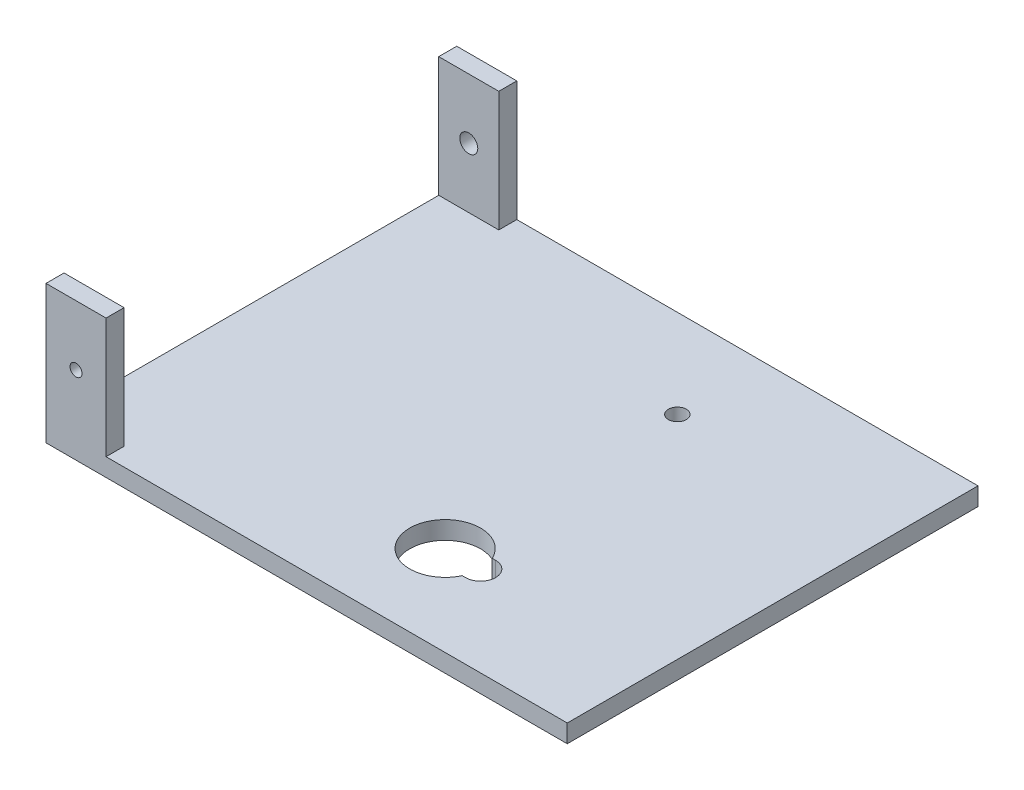
ISO-10303-21;
HEADER;
FILE_DESCRIPTION(('STEP AP214'),'2;1');
FILE_NAME('part.step','',(''),(''),'','','');
FILE_SCHEMA(('AUTOMOTIVE_DESIGN { 1 0 10303 214 1 1 1 1 }'));
ENDSEC;
DATA;
#1=APPLICATION_CONTEXT('core data for automotive mechanical design processes');
#2=APPLICATION_PROTOCOL_DEFINITION('international standard','automotive_design',2000,#1);
#3=PRODUCT_CONTEXT('',#1,'mechanical');
#4=PRODUCT('Part','Part','',(#3));
#5=PRODUCT_RELATED_PRODUCT_CATEGORY('part','',(#4));
#6=PRODUCT_DEFINITION_FORMATION('','',#4);
#7=PRODUCT_DEFINITION_CONTEXT('part definition',#1,'design');
#8=PRODUCT_DEFINITION('design','',#6,#7);
#9=PRODUCT_DEFINITION_SHAPE('','',#8);
#10=(LENGTH_UNIT() NAMED_UNIT(*) SI_UNIT(.MILLI.,.METRE.));
#11=(NAMED_UNIT(*) PLANE_ANGLE_UNIT() SI_UNIT($,.RADIAN.));
#12=(NAMED_UNIT(*) SI_UNIT($,.STERADIAN.) SOLID_ANGLE_UNIT());
#13=UNCERTAINTY_MEASURE_WITH_UNIT(LENGTH_MEASURE(1.E-05),#10,'distance_accuracy_value','');
#14=(GEOMETRIC_REPRESENTATION_CONTEXT(3) GLOBAL_UNCERTAINTY_ASSIGNED_CONTEXT((#13)) GLOBAL_UNIT_ASSIGNED_CONTEXT((#10,
#11,#12)) REPRESENTATION_CONTEXT('',''));
#15=CARTESIAN_POINT('',(0.,0.,0.));
#16=DIRECTION('',(0.,0.,1.));
#17=DIRECTION('',(1.,0.,0.));
#18=AXIS2_PLACEMENT_3D('',#15,#16,#17);
#19=CARTESIAN_POINT('',(0.,3.,0.));
#20=DIRECTION('',(0.,1.,0.));
#21=DIRECTION('',(0.,0.,1.));
#22=AXIS2_PLACEMENT_3D('',#19,#20,#21);
#23=PLANE('',#22);
#24=CARTESIAN_POINT('',(51.4651749457826,3.,53.4));
#25=DIRECTION('',(0.,1.,0.));
#26=DIRECTION('',(0.,0.,1.));
#27=AXIS2_PLACEMENT_3D('',#24,#25,#26);
#28=CIRCLE('',#27,5.9);
#29=CARTESIAN_POINT('',(56.8093306321376,3.,50.9));
#30=VERTEX_POINT('',#29);
#31=CARTESIAN_POINT('',(56.8093306321376,3.,55.9));
#32=VERTEX_POINT('',#31);
#33=EDGE_CURVE('E168',#30,#32,#28,.T.);
#34=ORIENTED_EDGE('',*,*,#33,.F.);
#35=DIRECTION('',(-1.,0.,0.));
#36=VECTOR('',#35,1.);
#37=CARTESIAN_POINT('',(6.30695892337293E-13,3.,50.9000000000007));
#38=LINE('',#37,#36);
#39=CARTESIAN_POINT('',(57.3693306321376,3.,50.9));
#40=VERTEX_POINT('',#39);
#41=EDGE_CURVE('E161',#40,#30,#38,.T.);
#42=ORIENTED_EDGE('',*,*,#41,.F.);
#43=CARTESIAN_POINT('',(57.3693306321376,3.,53.4));
#44=DIRECTION('',(0.,1.,0.));
#45=DIRECTION('',(0.,0.,1.));
#46=AXIS2_PLACEMENT_3D('',#43,#44,#45);
#47=CIRCLE('',#46,2.5);
#48=CARTESIAN_POINT('',(57.3693306321376,3.,55.9));
#49=VERTEX_POINT('',#48);
#50=EDGE_CURVE('E141',#49,#40,#47,.T.);
#51=ORIENTED_EDGE('',*,*,#50,.F.);
#52=DIRECTION('',(1.,0.,0.));
#53=VECTOR('',#52,1.);
#54=CARTESIAN_POINT('',(0.,3.,55.9));
#55=LINE('',#54,#53);
#56=EDGE_CURVE('E166',#32,#49,#55,.T.);
#57=ORIENTED_EDGE('',*,*,#56,.F.);
#58=EDGE_LOOP('',(#34,#42,#51,#57));
#59=FACE_BOUND('',#58,.T.);
#60=CARTESIAN_POINT('',(51.4651749457826,3.,14.7308319093042));
#61=DIRECTION('',(0.,1.,0.));
#62=DIRECTION('',(0.,0.,1.));
#63=AXIS2_PLACEMENT_3D('',#60,#61,#62);
#64=CIRCLE('',#63,1.5);
#65=CARTESIAN_POINT('',(51.4651749457826,3.,16.2308319093042));
#66=VERTEX_POINT('',#65);
#67=EDGE_CURVE('E173',#66,#66,#64,.T.);
#68=ORIENTED_EDGE('',*,*,#67,.F.);
#69=EDGE_LOOP('',(#68));
#70=FACE_BOUND('',#69,.T.);
#71=DIRECTION('',(0.,0.,-1.));
#72=VECTOR('',#71,1.);
#73=CARTESIAN_POINT('',(10.,3.,0.));
#74=LINE('',#73,#72);
#75=CARTESIAN_POINT('',(10.,3.,3.));
#76=VERTEX_POINT('',#75);
#77=CARTESIAN_POINT('',(10.,3.,0.));
#78=VERTEX_POINT('',#77);
#79=EDGE_CURVE('E189',#76,#78,#74,.T.);
#80=ORIENTED_EDGE('',*,*,#79,.F.);
#81=DIRECTION('',(1.,0.,0.));
#82=VECTOR('',#81,1.);
#83=CARTESIAN_POINT('',(0.,3.,3.));
#84=LINE('',#83,#82);
#85=CARTESIAN_POINT('',(0.,3.,3.));
#86=VERTEX_POINT('',#85);
#87=EDGE_CURVE('E197',#86,#76,#84,.T.);
#88=ORIENTED_EDGE('',*,*,#87,.F.);
#89=DIRECTION('',(0.,0.,1.));
#90=VECTOR('',#89,1.);
#91=CARTESIAN_POINT('',(0.,3.,0.));
#92=LINE('',#91,#90);
#93=CARTESIAN_POINT('',(0.,3.,65.4));
#94=VERTEX_POINT('',#93);
#95=EDGE_CURVE('E235',#86,#94,#92,.T.);
#96=ORIENTED_EDGE('',*,*,#95,.T.);
#97=DIRECTION('',(-1.,0.,0.));
#98=VECTOR('',#97,1.);
#99=CARTESIAN_POINT('',(0.,3.,65.4));
#100=LINE('',#99,#98);
#101=CARTESIAN_POINT('',(10.,3.,65.4));
#102=VERTEX_POINT('',#101);
#103=EDGE_CURVE('E215',#102,#94,#100,.T.);
#104=ORIENTED_EDGE('',*,*,#103,.F.);
#105=DIRECTION('',(0.,0.,-1.));
#106=VECTOR('',#105,1.);
#107=CARTESIAN_POINT('',(10.,3.,68.4));
#108=LINE('',#107,#106);
#109=CARTESIAN_POINT('',(10.,3.,68.4));
#110=VERTEX_POINT('',#109);
#111=EDGE_CURVE('E210',#110,#102,#108,.T.);
#112=ORIENTED_EDGE('',*,*,#111,.F.);
#113=DIRECTION('',(1.,0.,0.));
#114=VECTOR('',#113,1.);
#115=CARTESIAN_POINT('',(0.,3.,68.4));
#116=LINE('',#115,#114);
#117=CARTESIAN_POINT('',(86.8,3.,68.4));
#118=VERTEX_POINT('',#117);
#119=EDGE_CURVE('E237',#110,#118,#116,.T.);
#120=ORIENTED_EDGE('',*,*,#119,.T.);
#121=DIRECTION('',(0.,0.,-1.));
#122=VECTOR('',#121,1.);
#123=CARTESIAN_POINT('',(86.8,3.,0.));
#124=LINE('',#123,#122);
#125=CARTESIAN_POINT('',(86.8,3.,0.));
#126=VERTEX_POINT('',#125);
#127=EDGE_CURVE('E240',#118,#126,#124,.T.);
#128=ORIENTED_EDGE('',*,*,#127,.T.);
#129=DIRECTION('',(-1.,0.,0.));
#130=VECTOR('',#129,1.);
#131=CARTESIAN_POINT('',(0.,3.,0.));
#132=LINE('',#131,#130);
#133=EDGE_CURVE('E242',#126,#78,#132,.T.);
#134=ORIENTED_EDGE('',*,*,#133,.T.);
#135=EDGE_LOOP('',(#80,#88,#96,#104,#112,#120,#128,#134));
#136=FACE_BOUND('',#135,.T.);
#137=ADVANCED_FACE('F33',(#59,#70,#136),#23,.T.);
#138=CARTESIAN_POINT('',(0.,3.,0.));
#139=DIRECTION('',(1.,0.,0.));
#140=DIRECTION('',(0.,0.,-1.));
#141=AXIS2_PLACEMENT_3D('',#138,#139,#140);
#142=PLANE('',#141);
#143=DIRECTION('',(0.,0.,1.));
#144=VECTOR('',#143,1.);
#145=CARTESIAN_POINT('',(0.,0.,0.));
#146=LINE('',#145,#144);
#147=CARTESIAN_POINT('',(0.,0.,0.));
#148=VERTEX_POINT('',#147);
#149=CARTESIAN_POINT('',(0.,0.,68.4));
#150=VERTEX_POINT('',#149);
#151=EDGE_CURVE('E234',#148,#150,#146,.T.);
#152=ORIENTED_EDGE('',*,*,#151,.T.);
#153=DIRECTION('',(0.,-1.,0.));
#154=VECTOR('',#153,1.);
#155=CARTESIAN_POINT('',(0.,3.,68.4));
#156=LINE('',#155,#154);
#157=CARTESIAN_POINT('',(0.,23.,68.4));
#158=VERTEX_POINT('',#157);
#159=EDGE_CURVE('E11',#158,#150,#156,.T.);
#160=ORIENTED_EDGE('',*,*,#159,.F.);
#161=DIRECTION('',(0.,0.,1.));
#162=VECTOR('',#161,1.);
#163=CARTESIAN_POINT('',(0.,23.,68.4));
#164=LINE('',#163,#162);
#165=CARTESIAN_POINT('',(0.,23.,65.4));
#166=VERTEX_POINT('',#165);
#167=EDGE_CURVE('E211',#166,#158,#164,.T.);
#168=ORIENTED_EDGE('',*,*,#167,.F.);
#169=DIRECTION('',(0.,-1.,0.));
#170=VECTOR('',#169,1.);
#171=CARTESIAN_POINT('',(0.,23.,65.4));
#172=LINE('',#171,#170);
#173=EDGE_CURVE('E221',#166,#94,#172,.T.);
#174=ORIENTED_EDGE('',*,*,#173,.T.);
#175=ORIENTED_EDGE('',*,*,#95,.F.);
#176=DIRECTION('',(0.,-1.,0.));
#177=VECTOR('',#176,1.);
#178=CARTESIAN_POINT('',(0.,23.,3.));
#179=LINE('',#178,#177);
#180=CARTESIAN_POINT('',(0.,23.,3.));
#181=VERTEX_POINT('',#180);
#182=EDGE_CURVE('E207',#181,#86,#179,.T.);
#183=ORIENTED_EDGE('',*,*,#182,.F.);
#184=DIRECTION('',(0.,0.,1.));
#185=VECTOR('',#184,1.);
#186=CARTESIAN_POINT('',(0.,23.,0.));
#187=LINE('',#186,#185);
#188=CARTESIAN_POINT('',(0.,23.,0.));
#189=VERTEX_POINT('',#188);
#190=EDGE_CURVE('E185',#189,#181,#187,.T.);
#191=ORIENTED_EDGE('',*,*,#190,.F.);
#192=DIRECTION('',(0.,-1.,0.));
#193=VECTOR('',#192,1.);
#194=CARTESIAN_POINT('',(0.,3.,0.));
#195=LINE('',#194,#193);
#196=EDGE_CURVE('E244',#189,#148,#195,.T.);
#197=ORIENTED_EDGE('',*,*,#196,.T.);
#198=EDGE_LOOP('',(#152,#160,#168,#174,#175,#183,#191,#197));
#199=FACE_BOUND('',#198,.T.);
#200=ADVANCED_FACE('F35',(#199),#142,.F.);
#201=CARTESIAN_POINT('',(0.,3.,68.4));
#202=DIRECTION('',(0.,0.,-1.));
#203=DIRECTION('',(-1.,0.,0.));
#204=AXIS2_PLACEMENT_3D('',#201,#202,#203);
#205=PLANE('',#204);
#206=CARTESIAN_POINT('',(5.,13.,68.4));
#207=DIRECTION('',(0.,0.,1.));
#208=DIRECTION('',(1.,0.,0.));
#209=AXIS2_PLACEMENT_3D('',#206,#207,#208);
#210=CIRCLE('',#209,1.);
#211=CARTESIAN_POINT('',(6.,13.,68.4));
#212=VERTEX_POINT('',#211);
#213=EDGE_CURVE('E182',#212,#212,#210,.T.);
#214=ORIENTED_EDGE('',*,*,#213,.F.);
#215=EDGE_LOOP('',(#214));
#216=FACE_BOUND('',#215,.T.);
#217=DIRECTION('',(1.,0.,0.));
#218=VECTOR('',#217,1.);
#219=CARTESIAN_POINT('',(0.,0.,68.4));
#220=LINE('',#219,#218);
#221=CARTESIAN_POINT('',(86.8,0.,68.4));
#222=VERTEX_POINT('',#221);
#223=EDGE_CURVE('E247',#150,#222,#220,.T.);
#224=ORIENTED_EDGE('',*,*,#223,.T.);
#225=DIRECTION('',(0.,-1.,0.));
#226=VECTOR('',#225,1.);
#227=CARTESIAN_POINT('',(86.8,3.,68.4));
#228=LINE('',#227,#226);
#229=EDGE_CURVE('E42',#118,#222,#228,.T.);
#230=ORIENTED_EDGE('',*,*,#229,.F.);
#231=ORIENTED_EDGE('',*,*,#119,.F.);
#232=DIRECTION('',(0.,-1.,0.));
#233=VECTOR('',#232,1.);
#234=CARTESIAN_POINT('',(10.,23.,68.4));
#235=LINE('',#234,#233);
#236=CARTESIAN_POINT('',(10.,23.,68.4));
#237=VERTEX_POINT('',#236);
#238=EDGE_CURVE('E231',#237,#110,#235,.T.);
#239=ORIENTED_EDGE('',*,*,#238,.F.);
#240=DIRECTION('',(1.,0.,0.));
#241=VECTOR('',#240,1.);
#242=CARTESIAN_POINT('',(0.,23.,68.4));
#243=LINE('',#242,#241);
#244=EDGE_CURVE('E214',#158,#237,#243,.T.);
#245=ORIENTED_EDGE('',*,*,#244,.F.);
#246=ORIENTED_EDGE('',*,*,#159,.T.);
#247=EDGE_LOOP('',(#224,#230,#231,#239,#245,#246));
#248=FACE_BOUND('',#247,.T.);
#249=ADVANCED_FACE('F308',(#216,#248),#205,.F.);
#250=CARTESIAN_POINT('',(86.8,3.,0.));
#251=DIRECTION('',(-1.,0.,0.));
#252=DIRECTION('',(0.,0.,1.));
#253=AXIS2_PLACEMENT_3D('',#250,#251,#252);
#254=PLANE('',#253);
#255=DIRECTION('',(0.,0.,-1.));
#256=VECTOR('',#255,1.);
#257=CARTESIAN_POINT('',(86.8,0.,0.));
#258=LINE('',#257,#256);
#259=CARTESIAN_POINT('',(86.8,0.,0.));
#260=VERTEX_POINT('',#259);
#261=EDGE_CURVE('E249',#222,#260,#258,.T.);
#262=ORIENTED_EDGE('',*,*,#261,.T.);
#263=DIRECTION('',(0.,-1.,0.));
#264=VECTOR('',#263,1.);
#265=CARTESIAN_POINT('',(86.8,3.,0.));
#266=LINE('',#265,#264);
#267=EDGE_CURVE('E254',#126,#260,#266,.T.);
#268=ORIENTED_EDGE('',*,*,#267,.F.);
#269=ORIENTED_EDGE('',*,*,#127,.F.);
#270=ORIENTED_EDGE('',*,*,#229,.T.);
#271=EDGE_LOOP('',(#262,#268,#269,#270));
#272=FACE_BOUND('',#271,.T.);
#273=ADVANCED_FACE('F262',(#272),#254,.F.);
#274=CARTESIAN_POINT('',(0.,3.,0.));
#275=DIRECTION('',(0.,0.,1.));
#276=DIRECTION('',(1.,0.,0.));
#277=AXIS2_PLACEMENT_3D('',#274,#275,#276);
#278=PLANE('',#277);
#279=CARTESIAN_POINT('',(5.,13.,0.));
#280=DIRECTION('',(0.,0.,1.));
#281=DIRECTION('',(1.,0.,0.));
#282=AXIS2_PLACEMENT_3D('',#279,#280,#281);
#283=CIRCLE('',#282,1.5);
#284=CARTESIAN_POINT('',(6.5,13.,0.));
#285=VERTEX_POINT('',#284);
#286=EDGE_CURVE('E179',#285,#285,#283,.T.);
#287=ORIENTED_EDGE('',*,*,#286,.T.);
#288=EDGE_LOOP('',(#287));
#289=FACE_BOUND('',#288,.T.);
#290=DIRECTION('',(-1.,0.,0.));
#291=VECTOR('',#290,1.);
#292=CARTESIAN_POINT('',(0.,0.,0.));
#293=LINE('',#292,#291);
#294=EDGE_CURVE('E238',#260,#148,#293,.T.);
#295=ORIENTED_EDGE('',*,*,#294,.T.);
#296=ORIENTED_EDGE('',*,*,#196,.F.);
#297=DIRECTION('',(-1.,0.,0.));
#298=VECTOR('',#297,1.);
#299=CARTESIAN_POINT('',(0.,23.,0.));
#300=LINE('',#299,#298);
#301=CARTESIAN_POINT('',(10.,23.,0.));
#302=VERTEX_POINT('',#301);
#303=EDGE_CURVE('E193',#302,#189,#300,.T.);
#304=ORIENTED_EDGE('',*,*,#303,.F.);
#305=DIRECTION('',(0.,-1.,0.));
#306=VECTOR('',#305,1.);
#307=CARTESIAN_POINT('',(10.,23.,0.));
#308=LINE('',#307,#306);
#309=EDGE_CURVE('E196',#302,#78,#308,.T.);
#310=ORIENTED_EDGE('',*,*,#309,.T.);
#311=ORIENTED_EDGE('',*,*,#133,.F.);
#312=ORIENTED_EDGE('',*,*,#267,.T.);
#313=EDGE_LOOP('',(#295,#296,#304,#310,#311,#312));
#314=FACE_BOUND('',#313,.T.);
#315=ADVANCED_FACE('F270',(#289,#314),#278,.F.);
#316=CARTESIAN_POINT('',(0.,0.,0.));
#317=DIRECTION('',(0.,1.,0.));
#318=DIRECTION('',(0.,0.,1.));
#319=AXIS2_PLACEMENT_3D('',#316,#317,#318);
#320=PLANE('',#319);
#321=DIRECTION('',(1.,0.,0.));
#322=VECTOR('',#321,1.);
#323=CARTESIAN_POINT('',(57.3693306321376,0.,50.9));
#324=LINE('',#323,#322);
#325=CARTESIAN_POINT('',(56.8093306321376,0.,50.9));
#326=VERTEX_POINT('',#325);
#327=CARTESIAN_POINT('',(57.3693306321376,0.,50.9));
#328=VERTEX_POINT('',#327);
#329=EDGE_CURVE('E147',#326,#328,#324,.T.);
#330=ORIENTED_EDGE('',*,*,#329,.F.);
#331=CARTESIAN_POINT('',(51.4651749457826,0.,53.4));
#332=DIRECTION('',(0.,-1.,0.));
#333=DIRECTION('',(0.,0.,-1.));
#334=AXIS2_PLACEMENT_3D('',#331,#332,#333);
#335=CIRCLE('',#334,5.9);
#336=CARTESIAN_POINT('',(56.8093306321376,0.,55.9));
#337=VERTEX_POINT('',#336);
#338=EDGE_CURVE('E57',#337,#326,#335,.T.);
#339=ORIENTED_EDGE('',*,*,#338,.F.);
#340=DIRECTION('',(-1.,0.,0.));
#341=VECTOR('',#340,1.);
#342=CARTESIAN_POINT('',(56.8093306321376,0.,55.9));
#343=LINE('',#342,#341);
#344=CARTESIAN_POINT('',(57.3693306321376,0.,55.9));
#345=VERTEX_POINT('',#344);
#346=EDGE_CURVE('E154',#345,#337,#343,.T.);
#347=ORIENTED_EDGE('',*,*,#346,.F.);
#348=CARTESIAN_POINT('',(57.3693306321376,0.,53.4));
#349=DIRECTION('',(0.,-1.,0.));
#350=DIRECTION('',(0.,0.,1.));
#351=AXIS2_PLACEMENT_3D('',#348,#349,#350);
#352=CIRCLE('',#351,2.5);
#353=EDGE_CURVE('E138',#328,#345,#352,.T.);
#354=ORIENTED_EDGE('',*,*,#353,.F.);
#355=EDGE_LOOP('',(#330,#339,#347,#354));
#356=FACE_BOUND('',#355,.T.);
#357=CARTESIAN_POINT('',(51.4651749457826,0.,14.7308319093042));
#358=DIRECTION('',(0.,-1.,0.));
#359=DIRECTION('',(0.,0.,-1.));
#360=AXIS2_PLACEMENT_3D('',#357,#358,#359);
#361=CIRCLE('',#360,1.5);
#362=CARTESIAN_POINT('',(51.4651749457826,0.,13.2308319093042));
#363=VERTEX_POINT('',#362);
#364=EDGE_CURVE('E170',#363,#363,#361,.T.);
#365=ORIENTED_EDGE('',*,*,#364,.F.);
#366=EDGE_LOOP('',(#365));
#367=FACE_BOUND('',#366,.T.);
#368=ORIENTED_EDGE('',*,*,#151,.F.);
#369=ORIENTED_EDGE('',*,*,#294,.F.);
#370=ORIENTED_EDGE('',*,*,#261,.F.);
#371=ORIENTED_EDGE('',*,*,#223,.F.);
#372=EDGE_LOOP('',(#368,#369,#370,#371));
#373=FACE_BOUND('',#372,.T.);
#374=ADVANCED_FACE('F151',(#356,#367,#373),#320,.F.);
#375=CARTESIAN_POINT('',(10.,23.,68.4));
#376=DIRECTION('',(-1.,0.,0.));
#377=DIRECTION('',(0.,0.,1.));
#378=AXIS2_PLACEMENT_3D('',#375,#376,#377);
#379=PLANE('',#378);
#380=ORIENTED_EDGE('',*,*,#111,.T.);
#381=DIRECTION('',(0.,-1.,0.));
#382=VECTOR('',#381,1.);
#383=CARTESIAN_POINT('',(10.,23.,65.4));
#384=LINE('',#383,#382);
#385=CARTESIAN_POINT('',(10.,23.,65.4));
#386=VERTEX_POINT('',#385);
#387=EDGE_CURVE('E228',#386,#102,#384,.T.);
#388=ORIENTED_EDGE('',*,*,#387,.F.);
#389=DIRECTION('',(0.,0.,-1.));
#390=VECTOR('',#389,1.);
#391=CARTESIAN_POINT('',(10.,23.,68.4));
#392=LINE('',#391,#390);
#393=EDGE_CURVE('E217',#237,#386,#392,.T.);
#394=ORIENTED_EDGE('',*,*,#393,.F.);
#395=ORIENTED_EDGE('',*,*,#238,.T.);
#396=EDGE_LOOP('',(#380,#388,#394,#395));
#397=FACE_BOUND('',#396,.T.);
#398=ADVANCED_FACE('F313',(#397),#379,.F.);
#399=CARTESIAN_POINT('',(0.,23.,65.4));
#400=DIRECTION('',(0.,0.,1.));
#401=DIRECTION('',(1.,0.,0.));
#402=AXIS2_PLACEMENT_3D('',#399,#400,#401);
#403=PLANE('',#402);
#404=CARTESIAN_POINT('',(5.,13.,65.4));
#405=DIRECTION('',(0.,0.,1.));
#406=DIRECTION('',(1.,0.,0.));
#407=AXIS2_PLACEMENT_3D('',#404,#405,#406);
#408=CIRCLE('',#407,1.);
#409=CARTESIAN_POINT('',(6.,13.,65.4));
#410=VERTEX_POINT('',#409);
#411=EDGE_CURVE('E37',#410,#410,#408,.T.);
#412=ORIENTED_EDGE('',*,*,#411,.T.);
#413=EDGE_LOOP('',(#412));
#414=FACE_BOUND('',#413,.T.);
#415=ORIENTED_EDGE('',*,*,#103,.T.);
#416=ORIENTED_EDGE('',*,*,#173,.F.);
#417=DIRECTION('',(-1.,0.,0.));
#418=VECTOR('',#417,1.);
#419=CARTESIAN_POINT('',(0.,23.,65.4));
#420=LINE('',#419,#418);
#421=EDGE_CURVE('E219',#386,#166,#420,.T.);
#422=ORIENTED_EDGE('',*,*,#421,.F.);
#423=ORIENTED_EDGE('',*,*,#387,.T.);
#424=EDGE_LOOP('',(#415,#416,#422,#423));
#425=FACE_BOUND('',#424,.T.);
#426=ADVANCED_FACE('F296',(#414,#425),#403,.F.);
#427=CARTESIAN_POINT('',(0.,23.,0.));
#428=DIRECTION('',(0.,-1.,0.));
#429=DIRECTION('',(0.,0.,-1.));
#430=AXIS2_PLACEMENT_3D('',#427,#428,#429);
#431=PLANE('',#430);
#432=ORIENTED_EDGE('',*,*,#167,.T.);
#433=ORIENTED_EDGE('',*,*,#244,.T.);
#434=ORIENTED_EDGE('',*,*,#393,.T.);
#435=ORIENTED_EDGE('',*,*,#421,.T.);
#436=EDGE_LOOP('',(#432,#433,#434,#435));
#437=FACE_BOUND('',#436,.T.);
#438=ADVANCED_FACE('F288',(#437),#431,.F.);
#439=CARTESIAN_POINT('',(0.,23.,3.));
#440=DIRECTION('',(0.,0.,-1.));
#441=DIRECTION('',(-1.,0.,0.));
#442=AXIS2_PLACEMENT_3D('',#439,#440,#441);
#443=PLANE('',#442);
#444=CARTESIAN_POINT('',(5.,13.,3.));
#445=DIRECTION('',(0.,0.,1.));
#446=DIRECTION('',(1.,0.,0.));
#447=AXIS2_PLACEMENT_3D('',#444,#445,#446);
#448=CIRCLE('',#447,1.5);
#449=CARTESIAN_POINT('',(6.5,13.,3.));
#450=VERTEX_POINT('',#449);
#451=EDGE_CURVE('E176',#450,#450,#448,.T.);
#452=ORIENTED_EDGE('',*,*,#451,.F.);
#453=EDGE_LOOP('',(#452));
#454=FACE_BOUND('',#453,.T.);
#455=ORIENTED_EDGE('',*,*,#87,.T.);
#456=DIRECTION('',(0.,-1.,0.));
#457=VECTOR('',#456,1.);
#458=CARTESIAN_POINT('',(10.,23.,3.));
#459=LINE('',#458,#457);
#460=CARTESIAN_POINT('',(10.,23.,3.));
#461=VERTEX_POINT('',#460);
#462=EDGE_CURVE('E204',#461,#76,#459,.T.);
#463=ORIENTED_EDGE('',*,*,#462,.F.);
#464=DIRECTION('',(1.,0.,0.));
#465=VECTOR('',#464,1.);
#466=CARTESIAN_POINT('',(0.,23.,3.));
#467=LINE('',#466,#465);
#468=EDGE_CURVE('E188',#181,#461,#467,.T.);
#469=ORIENTED_EDGE('',*,*,#468,.F.);
#470=ORIENTED_EDGE('',*,*,#182,.T.);
#471=EDGE_LOOP('',(#455,#463,#469,#470));
#472=FACE_BOUND('',#471,.T.);
#473=ADVANCED_FACE('F286',(#454,#472),#443,.F.);
#474=CARTESIAN_POINT('',(10.,23.,0.));
#475=DIRECTION('',(-1.,0.,0.));
#476=DIRECTION('',(0.,0.,1.));
#477=AXIS2_PLACEMENT_3D('',#474,#475,#476);
#478=PLANE('',#477);
#479=ORIENTED_EDGE('',*,*,#79,.T.);
#480=ORIENTED_EDGE('',*,*,#309,.F.);
#481=DIRECTION('',(0.,0.,-1.));
#482=VECTOR('',#481,1.);
#483=CARTESIAN_POINT('',(10.,23.,0.));
#484=LINE('',#483,#482);
#485=EDGE_CURVE('E191',#461,#302,#484,.T.);
#486=ORIENTED_EDGE('',*,*,#485,.F.);
#487=ORIENTED_EDGE('',*,*,#462,.T.);
#488=EDGE_LOOP('',(#479,#480,#486,#487));
#489=FACE_BOUND('',#488,.T.);
#490=ADVANCED_FACE('F283',(#489),#478,.F.);
#491=CARTESIAN_POINT('',(0.,23.,0.));
#492=DIRECTION('',(0.,1.,0.));
#493=DIRECTION('',(0.,0.,1.));
#494=AXIS2_PLACEMENT_3D('',#491,#492,#493);
#495=PLANE('',#494);
#496=ORIENTED_EDGE('',*,*,#190,.T.);
#497=ORIENTED_EDGE('',*,*,#468,.T.);
#498=ORIENTED_EDGE('',*,*,#485,.T.);
#499=ORIENTED_EDGE('',*,*,#303,.T.);
#500=EDGE_LOOP('',(#496,#497,#498,#499));
#501=FACE_BOUND('',#500,.T.);
#502=ADVANCED_FACE('F278',(#501),#495,.T.);
#503=CARTESIAN_POINT('',(5.,13.,48.4));
#504=DIRECTION('',(0.,0.,1.));
#505=DIRECTION('',(1.,0.,0.));
#506=AXIS2_PLACEMENT_3D('',#503,#504,#505);
#507=CYLINDRICAL_SURFACE('',#506,1.);
#508=ORIENTED_EDGE('',*,*,#213,.T.);
#509=EDGE_LOOP('',(#508));
#510=FACE_BOUND('',#509,.T.);
#511=ORIENTED_EDGE('',*,*,#411,.F.);
#512=EDGE_LOOP('',(#511));
#513=FACE_BOUND('',#512,.T.);
#514=ADVANCED_FACE('F345',(#510,#513),#507,.F.);
#515=CARTESIAN_POINT('',(5.,13.,-17.));
#516=DIRECTION('',(0.,0.,1.));
#517=DIRECTION('',(1.,0.,0.));
#518=AXIS2_PLACEMENT_3D('',#515,#516,#517);
#519=CYLINDRICAL_SURFACE('',#518,1.5);
#520=ORIENTED_EDGE('',*,*,#451,.T.);
#521=EDGE_LOOP('',(#520));
#522=FACE_BOUND('',#521,.T.);
#523=ORIENTED_EDGE('',*,*,#286,.F.);
#524=EDGE_LOOP('',(#523));
#525=FACE_BOUND('',#524,.T.);
#526=ADVANCED_FACE('F347',(#522,#525),#519,.F.);
#527=CARTESIAN_POINT('',(51.4651749457826,20.,14.7308319093042));
#528=DIRECTION('',(0.,-1.,0.));
#529=DIRECTION('',(0.,0.,-1.));
#530=AXIS2_PLACEMENT_3D('',#527,#528,#529);
#531=CYLINDRICAL_SURFACE('',#530,1.5);
#532=ORIENTED_EDGE('',*,*,#67,.T.);
#533=EDGE_LOOP('',(#532));
#534=FACE_BOUND('',#533,.T.);
#535=ORIENTED_EDGE('',*,*,#364,.T.);
#536=EDGE_LOOP('',(#535));
#537=FACE_BOUND('',#536,.T.);
#538=ADVANCED_FACE('F354',(#534,#537),#531,.F.);
#539=CARTESIAN_POINT('',(51.4651749457826,10.,53.4));
#540=DIRECTION('',(0.,-1.,0.));
#541=DIRECTION('',(0.,0.,-1.));
#542=AXIS2_PLACEMENT_3D('',#539,#540,#541);
#543=CYLINDRICAL_SURFACE('',#542,5.9);
#544=ORIENTED_EDGE('',*,*,#33,.T.);
#545=DIRECTION('',(0.,-1.,0.));
#546=VECTOR('',#545,1.);
#547=CARTESIAN_POINT('',(56.8093306321376,10.,55.9));
#548=LINE('',#547,#546);
#549=EDGE_CURVE('E159',#32,#337,#548,.T.);
#550=ORIENTED_EDGE('',*,*,#549,.T.);
#551=ORIENTED_EDGE('',*,*,#338,.T.);
#552=DIRECTION('',(0.,-1.,0.));
#553=VECTOR('',#552,1.);
#554=CARTESIAN_POINT('',(56.8093306321376,10.,50.9));
#555=LINE('',#554,#553);
#556=EDGE_CURVE('E144',#30,#326,#555,.T.);
#557=ORIENTED_EDGE('',*,*,#556,.F.);
#558=EDGE_LOOP('',(#544,#550,#551,#557));
#559=FACE_BOUND('',#558,.T.);
#560=ADVANCED_FACE('F361',(#559),#543,.F.);
#561=CARTESIAN_POINT('',(56.8093306321376,10.,55.9));
#562=DIRECTION('',(0.,0.,1.));
#563=DIRECTION('',(1.,0.,0.));
#564=AXIS2_PLACEMENT_3D('',#561,#562,#563);
#565=PLANE('',#564);
#566=ORIENTED_EDGE('',*,*,#56,.T.);
#567=DIRECTION('',(0.,-1.,0.));
#568=VECTOR('',#567,1.);
#569=CARTESIAN_POINT('',(57.3693306321376,10.,55.9));
#570=LINE('',#569,#568);
#571=EDGE_CURVE('E143',#49,#345,#570,.T.);
#572=ORIENTED_EDGE('',*,*,#571,.T.);
#573=ORIENTED_EDGE('',*,*,#346,.T.);
#574=ORIENTED_EDGE('',*,*,#549,.F.);
#575=EDGE_LOOP('',(#566,#572,#573,#574));
#576=FACE_BOUND('',#575,.T.);
#577=ADVANCED_FACE('F365',(#576),#565,.F.);
#578=CARTESIAN_POINT('',(57.3693306321376,10.,53.4));
#579=DIRECTION('',(0.,-1.,0.));
#580=DIRECTION('',(0.,0.,-1.));
#581=AXIS2_PLACEMENT_3D('',#578,#579,#580);
#582=CYLINDRICAL_SURFACE('',#581,2.5);
#583=ORIENTED_EDGE('',*,*,#50,.T.);
#584=DIRECTION('',(0.,-1.,0.));
#585=VECTOR('',#584,1.);
#586=CARTESIAN_POINT('',(57.3693306321376,10.,50.9));
#587=LINE('',#586,#585);
#588=EDGE_CURVE('E49',#40,#328,#587,.T.);
#589=ORIENTED_EDGE('',*,*,#588,.T.);
#590=ORIENTED_EDGE('',*,*,#353,.T.);
#591=ORIENTED_EDGE('',*,*,#571,.F.);
#592=EDGE_LOOP('',(#583,#589,#590,#591));
#593=FACE_BOUND('',#592,.T.);
#594=ADVANCED_FACE('F135',(#593),#582,.F.);
#595=CARTESIAN_POINT('',(57.3693306321376,10.,50.9));
#596=DIRECTION('',(0.,0.,-1.));
#597=DIRECTION('',(-1.,0.,0.));
#598=AXIS2_PLACEMENT_3D('',#595,#596,#597);
#599=PLANE('',#598);
#600=ORIENTED_EDGE('',*,*,#41,.T.);
#601=ORIENTED_EDGE('',*,*,#556,.T.);
#602=ORIENTED_EDGE('',*,*,#329,.T.);
#603=ORIENTED_EDGE('',*,*,#588,.F.);
#604=EDGE_LOOP('',(#600,#601,#602,#603));
#605=FACE_BOUND('',#604,.T.);
#606=ADVANCED_FACE('F148',(#605),#599,.F.);
#607=CLOSED_SHELL('',(#137,#200,#249,#273,#315,#374,#398,#426,#438,#473,#490,#502,#514,#526,
#538,#560,#577,#594,#606));
#608=MANIFOLD_SOLID_BREP('B2',#607);
#609=ADVANCED_BREP_SHAPE_REPRESENTATION('',(#18,#608),#14);
#610=SHAPE_DEFINITION_REPRESENTATION(#9,#609);
ENDSEC;
END-ISO-10303-21;
